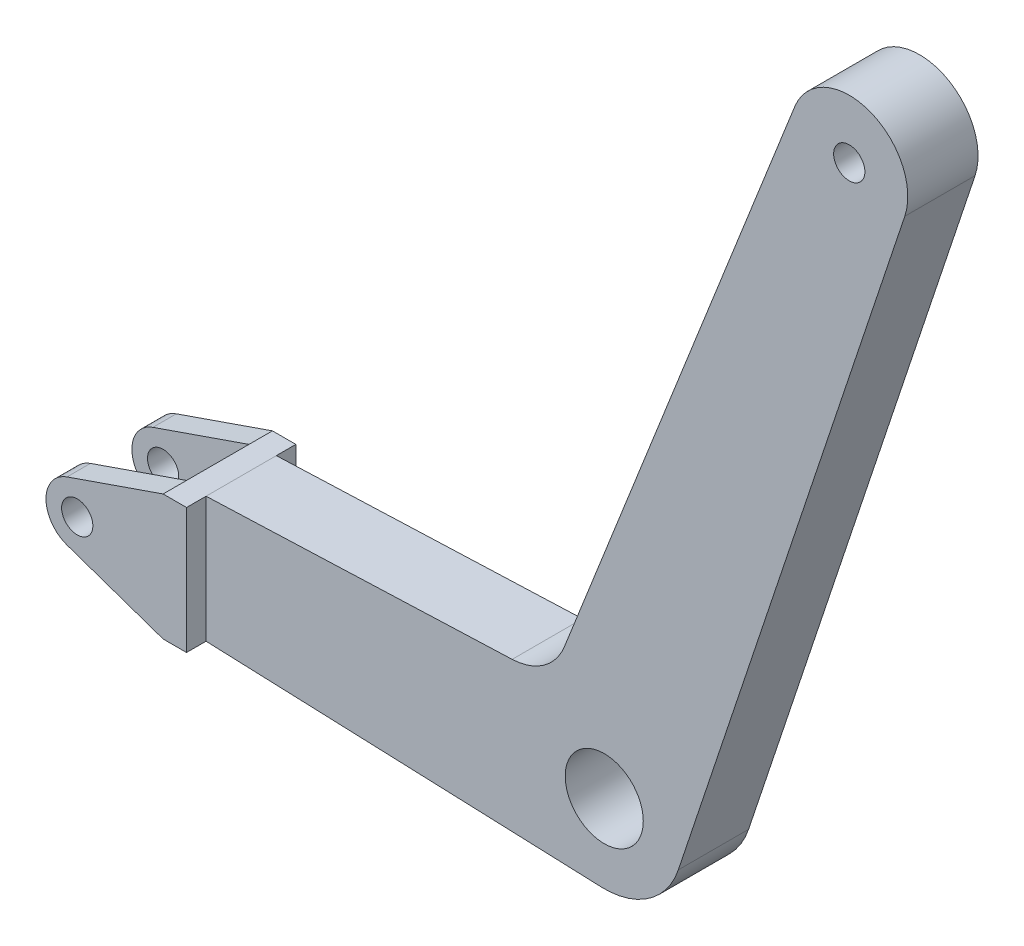
ISO-10303-21;
HEADER;
FILE_DESCRIPTION(('STEP AP214'),'2;1');
FILE_NAME('part.step','',(''),(''),'','','');
FILE_SCHEMA(('AUTOMOTIVE_DESIGN { 1 0 10303 214 1 1 1 1 }'));
ENDSEC;
DATA;
#1=APPLICATION_CONTEXT('core data for automotive mechanical design processes');
#2=APPLICATION_PROTOCOL_DEFINITION('international standard','automotive_design',2000,#1);
#3=PRODUCT_CONTEXT('',#1,'mechanical');
#4=PRODUCT('Part','Part','',(#3));
#5=PRODUCT_RELATED_PRODUCT_CATEGORY('part','',(#4));
#6=PRODUCT_DEFINITION_FORMATION('','',#4);
#7=PRODUCT_DEFINITION_CONTEXT('part definition',#1,'design');
#8=PRODUCT_DEFINITION('design','',#6,#7);
#9=PRODUCT_DEFINITION_SHAPE('','',#8);
#10=(LENGTH_UNIT() NAMED_UNIT(*) SI_UNIT(.MILLI.,.METRE.));
#11=(NAMED_UNIT(*) PLANE_ANGLE_UNIT() SI_UNIT($,.RADIAN.));
#12=(NAMED_UNIT(*) SI_UNIT($,.STERADIAN.) SOLID_ANGLE_UNIT());
#13=UNCERTAINTY_MEASURE_WITH_UNIT(LENGTH_MEASURE(1.E-05),#10,'distance_accuracy_value','');
#14=(GEOMETRIC_REPRESENTATION_CONTEXT(3) GLOBAL_UNCERTAINTY_ASSIGNED_CONTEXT((#13)) GLOBAL_UNIT_ASSIGNED_CONTEXT((#10,
#11,#12)) REPRESENTATION_CONTEXT('',''));
#15=CARTESIAN_POINT('',(0.,0.,0.));
#16=DIRECTION('',(0.,0.,1.));
#17=DIRECTION('',(1.,0.,0.));
#18=AXIS2_PLACEMENT_3D('',#15,#16,#17);
#19=CARTESIAN_POINT('',(-108.,0.,-7.49664954264655E-13));
#20=DIRECTION('',(1.,0.,0.));
#21=DIRECTION('',(0.,0.,-1.));
#22=AXIS2_PLACEMENT_3D('',#19,#20,#21);
#23=PLANE('',#22);
#24=DIRECTION('',(0.,1.,0.));
#25=VECTOR('',#24,1.);
#26=CARTESIAN_POINT('',(-108.,16.0888275014176,17.));
#27=LINE('',#26,#25);
#28=CARTESIAN_POINT('',(-108.,-16.0888275014176,17.));
#29=VERTEX_POINT('',#28);
#30=CARTESIAN_POINT('',(-108.,16.0888275014176,17.));
#31=VERTEX_POINT('',#30);
#32=EDGE_CURVE('E62',#29,#31,#27,.T.);
#33=ORIENTED_EDGE('',*,*,#32,.T.);
#34=DIRECTION('',(0.,0.,-1.));
#35=VECTOR('',#34,1.);
#36=CARTESIAN_POINT('',(-108.,16.0888275014176,8.99999999999996));
#37=LINE('',#36,#35);
#38=CARTESIAN_POINT('',(-108.,16.0888275014176,1.));
#39=VERTEX_POINT('',#38);
#40=EDGE_CURVE('E263',#31,#39,#37,.T.);
#41=ORIENTED_EDGE('',*,*,#40,.T.);
#42=DIRECTION('',(0.,1.,0.));
#43=VECTOR('',#42,1.);
#44=CARTESIAN_POINT('',(-108.,16.0888275014176,1.));
#45=LINE('',#44,#43);
#46=CARTESIAN_POINT('',(-108.,-16.0888275014176,0.999999999999999));
#47=VERTEX_POINT('',#46);
#48=EDGE_CURVE('E223',#47,#39,#45,.T.);
#49=ORIENTED_EDGE('',*,*,#48,.F.);
#50=DIRECTION('',(0.,0.,1.));
#51=VECTOR('',#50,1.);
#52=CARTESIAN_POINT('',(-108.,-16.0888275014176,8.99999999999996));
#53=LINE('',#52,#51);
#54=EDGE_CURVE('E264',#47,#29,#53,.T.);
#55=ORIENTED_EDGE('',*,*,#54,.T.);
#56=EDGE_LOOP('',(#33,#41,#49,#55));
#57=FACE_BOUND('',#56,.T.);
#58=ADVANCED_FACE('F45',(#57),#23,.F.);
#59=CARTESIAN_POINT('',(-23.5835194090592,19.1070792466231,18.));
#60=DIRECTION('',(0.0384615384615387,-0.999260081289737,0.));
#61=DIRECTION('',(0.999260081289737,0.0384615384615387,0.));
#62=AXIS2_PLACEMENT_3D('',#59,#60,#61);
#63=PLANE('',#62);
#64=DIRECTION('',(0.,0.,-1.));
#65=VECTOR('',#64,1.);
#66=CARTESIAN_POINT('',(-102.,16.0888275014176,17.9999999999995));
#67=LINE('',#66,#65);
#68=CARTESIAN_POINT('',(-102.,16.0888275014176,18.));
#69=VERTEX_POINT('',#68);
#70=CARTESIAN_POINT('',(-102.,16.0888275014176,0.));
#71=VERTEX_POINT('',#70);
#72=EDGE_CURVE('E300',#69,#71,#67,.T.);
#73=ORIENTED_EDGE('',*,*,#72,.F.);
#74=DIRECTION('',(-0.999260081289737,-0.0384615384615387,0.));
#75=VECTOR('',#74,1.);
#76=CARTESIAN_POINT('',(-23.5835194090592,19.1070792466231,18.));
#77=LINE('',#76,#75);
#78=CARTESIAN_POINT('',(-23.5835194090592,19.1070792466231,18.));
#79=VERTEX_POINT('',#78);
#80=EDGE_CURVE('E329',#79,#69,#77,.T.);
#81=ORIENTED_EDGE('',*,*,#80,.F.);
#82=DIRECTION('',(0.,0.,-1.));
#83=VECTOR('',#82,1.);
#84=CARTESIAN_POINT('',(-23.5835194090592,19.1070792466231,18.));
#85=LINE('',#84,#83);
#86=CARTESIAN_POINT('',(-23.5835194090592,19.1070792466231,0.));
#87=VERTEX_POINT('',#86);
#88=EDGE_CURVE('E55',#79,#87,#85,.T.);
#89=ORIENTED_EDGE('',*,*,#88,.T.);
#90=DIRECTION('',(-0.999260081289737,-0.0384615384615387,0.));
#91=VECTOR('',#90,1.);
#92=CARTESIAN_POINT('',(-23.5835194090592,19.1070792466231,0.));
#93=LINE('',#92,#91);
#94=EDGE_CURVE('E353',#87,#71,#93,.T.);
#95=ORIENTED_EDGE('',*,*,#94,.T.);
#96=EDGE_LOOP('',(#73,#81,#89,#95));
#97=FACE_BOUND('',#96,.T.);
#98=ADVANCED_FACE('F395',(#97),#63,.F.);
#99=CARTESIAN_POINT('',(-0.769230769230769,-19.9852016257947,18.));
#100=DIRECTION('',(0.0384615384615384,0.999260081289737,0.));
#101=DIRECTION('',(-0.999260081289737,0.0384615384615384,0.));
#102=AXIS2_PLACEMENT_3D('',#99,#100,#101);
#103=PLANE('',#102);
#104=DIRECTION('',(0.,0.,1.));
#105=VECTOR('',#104,1.);
#106=CARTESIAN_POINT('',(-102.,-16.0888275014176,17.9999999999993));
#107=LINE('',#106,#105);
#108=CARTESIAN_POINT('',(-102.,-16.0888275014176,0.));
#109=VERTEX_POINT('',#108);
#110=CARTESIAN_POINT('',(-102.,-16.0888275014176,18.));
#111=VERTEX_POINT('',#110);
#112=EDGE_CURVE('E297',#109,#111,#107,.T.);
#113=ORIENTED_EDGE('',*,*,#112,.F.);
#114=DIRECTION('',(0.999260081289737,-0.0384615384615384,0.));
#115=VECTOR('',#114,1.);
#116=CARTESIAN_POINT('',(-0.769230769230769,-19.9852016257947,0.));
#117=LINE('',#116,#115);
#118=CARTESIAN_POINT('',(-0.769230769230769,-19.9852016257947,0.));
#119=VERTEX_POINT('',#118);
#120=EDGE_CURVE('E357',#109,#119,#117,.T.);
#121=ORIENTED_EDGE('',*,*,#120,.T.);
#122=DIRECTION('',(0.,0.,-1.));
#123=VECTOR('',#122,1.);
#124=CARTESIAN_POINT('',(-0.769230769230769,-19.9852016257947,18.));
#125=LINE('',#124,#123);
#126=CARTESIAN_POINT('',(-0.769230769230769,-19.9852016257947,18.));
#127=VERTEX_POINT('',#126);
#128=EDGE_CURVE('E386',#127,#119,#125,.T.);
#129=ORIENTED_EDGE('',*,*,#128,.F.);
#130=DIRECTION('',(0.999260081289737,-0.0384615384615384,0.));
#131=VECTOR('',#130,1.);
#132=CARTESIAN_POINT('',(-0.769230769230769,-19.9852016257947,18.));
#133=LINE('',#132,#131);
#134=EDGE_CURVE('E334',#111,#127,#133,.T.);
#135=ORIENTED_EDGE('',*,*,#134,.F.);
#136=EDGE_LOOP('',(#113,#121,#129,#135));
#137=FACE_BOUND('',#136,.T.);
#138=ADVANCED_FACE('F417',(#137),#103,.F.);
#139=CARTESIAN_POINT('',(-24.1604424859823,34.0959804659692,18.));
#140=DIRECTION('',(0.,0.,1.));
#141=DIRECTION('',(1.,0.,0.));
#142=AXIS2_PLACEMENT_3D('',#139,#140,#141);
#143=PLANE('',#142);
#144=CARTESIAN_POINT('',(62.7606963002597,172.433595914214,18.));
#145=DIRECTION('',(0.,0.,1.));
#146=DIRECTION('',(1.,0.,0.));
#147=AXIS2_PLACEMENT_3D('',#144,#145,#146);
#148=CIRCLE('',#147,4.00000000000001);
#149=CARTESIAN_POINT('',(66.7606963002597,172.433595914214,18.));
#150=VERTEX_POINT('',#149);
#151=EDGE_CURVE('E309',#150,#150,#148,.T.);
#152=ORIENTED_EDGE('',*,*,#151,.F.);
#153=EDGE_LOOP('',(#152));
#154=FACE_BOUND('',#153,.T.);
#155=CARTESIAN_POINT('',(0.,0.,18.));
#156=DIRECTION('',(0.,0.,1.));
#157=DIRECTION('',(1.,0.,0.));
#158=AXIS2_PLACEMENT_3D('',#155,#156,#157);
#159=CIRCLE('',#158,10.);
#160=CARTESIAN_POINT('',(10.,0.,18.));
#161=VERTEX_POINT('',#160);
#162=EDGE_CURVE('E308',#161,#161,#159,.T.);
#163=ORIENTED_EDGE('',*,*,#162,.F.);
#164=EDGE_LOOP('',(#163));
#165=FACE_BOUND('',#164,.T.);
#166=ORIENTED_EDGE('',*,*,#80,.T.);
#167=DIRECTION('',(0.,-1.,0.));
#168=VECTOR('',#167,1.);
#169=CARTESIAN_POINT('',(-102.,34.0959804659692,18.));
#170=LINE('',#169,#168);
#171=EDGE_CURVE('E304',#69,#111,#170,.T.);
#172=ORIENTED_EDGE('',*,*,#171,.T.);
#173=ORIENTED_EDGE('',*,*,#134,.T.);
#174=CARTESIAN_POINT('',(0.,0.,18.));
#175=DIRECTION('',(0.,0.,1.));
#176=DIRECTION('',(1.,0.,0.));
#177=AXIS2_PLACEMENT_3D('',#174,#175,#176);
#178=CIRCLE('',#177,20.);
#179=CARTESIAN_POINT('',(18.973261360885,-6.3257689913201,18.));
#180=VERTEX_POINT('',#179);
#181=EDGE_CURVE('E337',#127,#180,#178,.T.);
#182=ORIENTED_EDGE('',*,*,#181,.T.);
#183=DIRECTION('',(0.316288449566005,0.948663068044252,0.));
#184=VECTOR('',#183,1.);
#185=CARTESIAN_POINT('',(18.973261360885,-6.3257689913201,18.));
#186=LINE('',#185,#184);
#187=CARTESIAN_POINT('',(76.9906423209234,167.689269170724,18.));
#188=VERTEX_POINT('',#187);
#189=EDGE_CURVE('E340',#180,#188,#186,.T.);
#190=ORIENTED_EDGE('',*,*,#189,.T.);
#191=CARTESIAN_POINT('',(62.7606963002597,172.433595914214,18.));
#192=DIRECTION('',(0.,0.,1.));
#193=DIRECTION('',(1.,0.,0.));
#194=AXIS2_PLACEMENT_3D('',#191,#192,#193);
#195=CIRCLE('',#194,15.);
#196=CARTESIAN_POINT('',(48.8103307782272,177.946063764614,18.));
#197=VERTEX_POINT('',#196);
#198=EDGE_CURVE('E343',#188,#197,#195,.T.);
#199=ORIENTED_EDGE('',*,*,#198,.T.);
#200=DIRECTION('',(-0.367497856693302,-0.930024368135496,0.));
#201=VECTOR('',#200,1.);
#202=CARTESIAN_POINT('',(48.8103307782272,177.946063764614,18.));
#203=LINE('',#202,#201);
#204=CARTESIAN_POINT('',(-10.2100769639498,28.5835126155697,18.));
#205=VERTEX_POINT('',#204);
#206=EDGE_CURVE('E346',#197,#205,#203,.T.);
#207=ORIENTED_EDGE('',*,*,#206,.T.);
#208=CARTESIAN_POINT('',(-24.1604424859823,34.0959804659692,18.));
#209=DIRECTION('',(0.,0.,-1.));
#210=DIRECTION('',(1.,0.,0.));
#211=AXIS2_PLACEMENT_3D('',#208,#209,#210);
#212=CIRCLE('',#211,15.);
#213=EDGE_CURVE('E325',#205,#79,#212,.T.);
#214=ORIENTED_EDGE('',*,*,#213,.T.);
#215=EDGE_LOOP('',(#166,#172,#173,#182,#190,#199,#207,#214));
#216=FACE_BOUND('',#215,.T.);
#217=ADVANCED_FACE('F421',(#154,#165,#216),#143,.T.);
#218=CARTESIAN_POINT('',(-24.1604424859823,34.0959804659692,0.));
#219=DIRECTION('',(0.,0.,1.));
#220=DIRECTION('',(1.,0.,0.));
#221=AXIS2_PLACEMENT_3D('',#218,#219,#220);
#222=PLANE('',#221);
#223=CARTESIAN_POINT('',(0.,0.,0.));
#224=DIRECTION('',(0.,0.,1.));
#225=DIRECTION('',(1.,0.,0.));
#226=AXIS2_PLACEMENT_3D('',#223,#224,#225);
#227=CIRCLE('',#226,10.);
#228=CARTESIAN_POINT('',(10.,0.,0.));
#229=VERTEX_POINT('',#228);
#230=EDGE_CURVE('E318',#229,#229,#227,.T.);
#231=ORIENTED_EDGE('',*,*,#230,.T.);
#232=EDGE_LOOP('',(#231));
#233=FACE_BOUND('',#232,.T.);
#234=CARTESIAN_POINT('',(62.7606963002597,172.433595914214,0.));
#235=DIRECTION('',(0.,0.,1.));
#236=DIRECTION('',(1.,0.,0.));
#237=AXIS2_PLACEMENT_3D('',#234,#235,#236);
#238=CIRCLE('',#237,4.00000000000001);
#239=CARTESIAN_POINT('',(66.7606963002597,172.433595914214,0.));
#240=VERTEX_POINT('',#239);
#241=EDGE_CURVE('E314',#240,#240,#238,.T.);
#242=ORIENTED_EDGE('',*,*,#241,.T.);
#243=EDGE_LOOP('',(#242));
#244=FACE_BOUND('',#243,.T.);
#245=DIRECTION('',(0.,-1.,0.));
#246=VECTOR('',#245,1.);
#247=CARTESIAN_POINT('',(-102.,34.0959804659692,0.));
#248=LINE('',#247,#246);
#249=EDGE_CURVE('E11',#71,#109,#248,.T.);
#250=ORIENTED_EDGE('',*,*,#249,.F.);
#251=ORIENTED_EDGE('',*,*,#94,.F.);
#252=CARTESIAN_POINT('',(-24.1604424859823,34.0959804659692,0.));
#253=DIRECTION('',(0.,0.,-1.));
#254=DIRECTION('',(1.,0.,0.));
#255=AXIS2_PLACEMENT_3D('',#252,#253,#254);
#256=CIRCLE('',#255,15.);
#257=CARTESIAN_POINT('',(-10.2100769639498,28.5835126155697,0.));
#258=VERTEX_POINT('',#257);
#259=EDGE_CURVE('E313',#258,#87,#256,.T.);
#260=ORIENTED_EDGE('',*,*,#259,.F.);
#261=DIRECTION('',(-0.367497856693302,-0.930024368135496,0.));
#262=VECTOR('',#261,1.);
#263=CARTESIAN_POINT('',(48.8103307782272,177.946063764614,0.));
#264=LINE('',#263,#262);
#265=CARTESIAN_POINT('',(48.8103307782272,177.946063764614,0.));
#266=VERTEX_POINT('',#265);
#267=EDGE_CURVE('E330',#266,#258,#264,.T.);
#268=ORIENTED_EDGE('',*,*,#267,.F.);
#269=CARTESIAN_POINT('',(62.7606963002597,172.433595914214,0.));
#270=DIRECTION('',(0.,0.,1.));
#271=DIRECTION('',(1.,0.,0.));
#272=AXIS2_PLACEMENT_3D('',#269,#270,#271);
#273=CIRCLE('',#272,15.);
#274=CARTESIAN_POINT('',(76.9906423209234,167.689269170724,0.));
#275=VERTEX_POINT('',#274);
#276=EDGE_CURVE('E366',#275,#266,#273,.T.);
#277=ORIENTED_EDGE('',*,*,#276,.F.);
#278=DIRECTION('',(0.316288449566005,0.948663068044252,0.));
#279=VECTOR('',#278,1.);
#280=CARTESIAN_POINT('',(18.973261360885,-6.3257689913201,0.));
#281=LINE('',#280,#279);
#282=CARTESIAN_POINT('',(18.973261360885,-6.3257689913201,0.));
#283=VERTEX_POINT('',#282);
#284=EDGE_CURVE('E363',#283,#275,#281,.T.);
#285=ORIENTED_EDGE('',*,*,#284,.F.);
#286=CARTESIAN_POINT('',(0.,0.,0.));
#287=DIRECTION('',(0.,0.,1.));
#288=DIRECTION('',(1.,0.,0.));
#289=AXIS2_PLACEMENT_3D('',#286,#287,#288);
#290=CIRCLE('',#289,20.);
#291=EDGE_CURVE('E360',#119,#283,#290,.T.);
#292=ORIENTED_EDGE('',*,*,#291,.F.);
#293=ORIENTED_EDGE('',*,*,#120,.F.);
#294=EDGE_LOOP('',(#250,#251,#260,#268,#277,#285,#292,#293));
#295=FACE_BOUND('',#294,.T.);
#296=ADVANCED_FACE('F403',(#233,#244,#295),#222,.F.);
#297=CARTESIAN_POINT('',(-24.1604424859823,34.0959804659692,18.));
#298=DIRECTION('',(0.,0.,-1.));
#299=DIRECTION('',(-1.,0.,0.));
#300=AXIS2_PLACEMENT_3D('',#297,#298,#299);
#301=CYLINDRICAL_SURFACE('',#300,15.);
#302=ORIENTED_EDGE('',*,*,#259,.T.);
#303=ORIENTED_EDGE('',*,*,#88,.F.);
#304=ORIENTED_EDGE('',*,*,#213,.F.);
#305=DIRECTION('',(0.,0.,-1.));
#306=VECTOR('',#305,1.);
#307=CARTESIAN_POINT('',(-10.2100769639498,28.5835126155697,18.));
#308=LINE('',#307,#306);
#309=EDGE_CURVE('E349',#205,#258,#308,.T.);
#310=ORIENTED_EDGE('',*,*,#309,.T.);
#311=EDGE_LOOP('',(#302,#303,#304,#310));
#312=FACE_BOUND('',#311,.T.);
#313=ADVANCED_FACE('F47',(#312),#301,.F.);
#314=CARTESIAN_POINT('',(0.,0.,18.));
#315=DIRECTION('',(0.,0.,-1.));
#316=DIRECTION('',(-1.,0.,0.));
#317=AXIS2_PLACEMENT_3D('',#314,#315,#316);
#318=CYLINDRICAL_SURFACE('',#317,20.);
#319=ORIENTED_EDGE('',*,*,#291,.T.);
#320=DIRECTION('',(0.,0.,-1.));
#321=VECTOR('',#320,1.);
#322=CARTESIAN_POINT('',(18.973261360885,-6.3257689913201,18.));
#323=LINE('',#322,#321);
#324=EDGE_CURVE('E382',#180,#283,#323,.T.);
#325=ORIENTED_EDGE('',*,*,#324,.F.);
#326=ORIENTED_EDGE('',*,*,#181,.F.);
#327=ORIENTED_EDGE('',*,*,#128,.T.);
#328=EDGE_LOOP('',(#319,#325,#326,#327));
#329=FACE_BOUND('',#328,.T.);
#330=ADVANCED_FACE('F507',(#329),#318,.T.);
#331=CARTESIAN_POINT('',(18.973261360885,-6.3257689913201,18.));
#332=DIRECTION('',(-0.948663068044252,0.316288449566005,0.));
#333=DIRECTION('',(-0.316288449566005,-0.948663068044252,0.));
#334=AXIS2_PLACEMENT_3D('',#331,#332,#333);
#335=PLANE('',#334);
#336=ORIENTED_EDGE('',*,*,#284,.T.);
#337=DIRECTION('',(0.,0.,-1.));
#338=VECTOR('',#337,1.);
#339=CARTESIAN_POINT('',(76.9906423209234,167.689269170724,18.));
#340=LINE('',#339,#338);
#341=EDGE_CURVE('E378',#188,#275,#340,.T.);
#342=ORIENTED_EDGE('',*,*,#341,.F.);
#343=ORIENTED_EDGE('',*,*,#189,.F.);
#344=ORIENTED_EDGE('',*,*,#324,.T.);
#345=EDGE_LOOP('',(#336,#342,#343,#344));
#346=FACE_BOUND('',#345,.T.);
#347=ADVANCED_FACE('F503',(#346),#335,.F.);
#348=CARTESIAN_POINT('',(62.7606963002597,172.433595914214,18.));
#349=DIRECTION('',(0.,0.,-1.));
#350=DIRECTION('',(-1.,0.,0.));
#351=AXIS2_PLACEMENT_3D('',#348,#349,#350);
#352=CYLINDRICAL_SURFACE('',#351,15.);
#353=ORIENTED_EDGE('',*,*,#276,.T.);
#354=DIRECTION('',(0.,0.,-1.));
#355=VECTOR('',#354,1.);
#356=CARTESIAN_POINT('',(48.8103307782272,177.946063764614,18.));
#357=LINE('',#356,#355);
#358=EDGE_CURVE('E374',#197,#266,#357,.T.);
#359=ORIENTED_EDGE('',*,*,#358,.F.);
#360=ORIENTED_EDGE('',*,*,#198,.F.);
#361=ORIENTED_EDGE('',*,*,#341,.T.);
#362=EDGE_LOOP('',(#353,#359,#360,#361));
#363=FACE_BOUND('',#362,.T.);
#364=ADVANCED_FACE('F499',(#363),#352,.T.);
#365=CARTESIAN_POINT('',(48.8103307782272,177.946063764614,18.));
#366=DIRECTION('',(0.930024368135496,-0.367497856693302,0.));
#367=DIRECTION('',(0.367497856693302,0.930024368135496,0.));
#368=AXIS2_PLACEMENT_3D('',#365,#366,#367);
#369=PLANE('',#368);
#370=ORIENTED_EDGE('',*,*,#267,.T.);
#371=ORIENTED_EDGE('',*,*,#309,.F.);
#372=ORIENTED_EDGE('',*,*,#206,.F.);
#373=ORIENTED_EDGE('',*,*,#358,.T.);
#374=EDGE_LOOP('',(#370,#371,#372,#373));
#375=FACE_BOUND('',#374,.T.);
#376=ADVANCED_FACE('F489',(#375),#369,.F.);
#377=CARTESIAN_POINT('',(0.,0.,18.));
#378=DIRECTION('',(0.,0.,-1.));
#379=DIRECTION('',(-1.,0.,0.));
#380=AXIS2_PLACEMENT_3D('',#377,#378,#379);
#381=CYLINDRICAL_SURFACE('',#380,10.);
#382=ORIENTED_EDGE('',*,*,#162,.T.);
#383=EDGE_LOOP('',(#382));
#384=FACE_BOUND('',#383,.T.);
#385=ORIENTED_EDGE('',*,*,#230,.F.);
#386=EDGE_LOOP('',(#385));
#387=FACE_BOUND('',#386,.T.);
#388=ADVANCED_FACE('F485',(#384,#387),#381,.F.);
#389=CARTESIAN_POINT('',(62.7606963002597,172.433595914214,18.));
#390=DIRECTION('',(0.,0.,-1.));
#391=DIRECTION('',(-1.,0.,0.));
#392=AXIS2_PLACEMENT_3D('',#389,#390,#391);
#393=CYLINDRICAL_SURFACE('',#392,4.00000000000001);
#394=ORIENTED_EDGE('',*,*,#151,.T.);
#395=EDGE_LOOP('',(#394));
#396=FACE_BOUND('',#395,.T.);
#397=ORIENTED_EDGE('',*,*,#241,.F.);
#398=EDGE_LOOP('',(#397));
#399=FACE_BOUND('',#398,.T.);
#400=ADVANCED_FACE('F482',(#396,#399),#393,.F.);
#401=CARTESIAN_POINT('',(-102.,0.,-7.07767178198537E-13));
#402=DIRECTION('',(1.,0.,0.));
#403=DIRECTION('',(0.,0.,-1.));
#404=AXIS2_PLACEMENT_3D('',#401,#402,#403);
#405=PLANE('',#404);
#406=ORIENTED_EDGE('',*,*,#171,.F.);
#407=DIRECTION('',(0.,0.,-1.));
#408=VECTOR('',#407,1.);
#409=CARTESIAN_POINT('',(-102.,16.0888275014176,9.));
#410=LINE('',#409,#408);
#411=CARTESIAN_POINT('',(-102.,16.0888275014176,23.));
#412=VERTEX_POINT('',#411);
#413=EDGE_CURVE('E272',#412,#69,#410,.T.);
#414=ORIENTED_EDGE('',*,*,#413,.F.);
#415=DIRECTION('',(0.,1.,0.));
#416=VECTOR('',#415,1.);
#417=CARTESIAN_POINT('',(-102.,16.0888275014176,23.));
#418=LINE('',#417,#416);
#419=CARTESIAN_POINT('',(-102.,-16.0888275014176,23.));
#420=VERTEX_POINT('',#419);
#421=EDGE_CURVE('E258',#420,#412,#418,.T.);
#422=ORIENTED_EDGE('',*,*,#421,.F.);
#423=DIRECTION('',(0.,0.,1.));
#424=VECTOR('',#423,1.);
#425=CARTESIAN_POINT('',(-102.,-16.0888275014176,9.));
#426=LINE('',#425,#424);
#427=EDGE_CURVE('E279',#111,#420,#426,.T.);
#428=ORIENTED_EDGE('',*,*,#427,.F.);
#429=EDGE_LOOP('',(#406,#414,#422,#428));
#430=FACE_BOUND('',#429,.T.);
#431=ADVANCED_FACE('F424',(#430),#405,.T.);
#432=CARTESIAN_POINT('',(-108.,16.0888275014176,23.));
#433=DIRECTION('',(0.,0.,-1.));
#434=DIRECTION('',(-1.,0.,0.));
#435=AXIS2_PLACEMENT_3D('',#432,#433,#434);
#436=PLANE('',#435);
#437=CARTESIAN_POINT('',(-130.,0.,22.9999999999998));
#438=DIRECTION('',(0.,0.,-1.));
#439=DIRECTION('',(-1.,0.,0.));
#440=AXIS2_PLACEMENT_3D('',#437,#438,#439);
#441=CIRCLE('',#440,3.99999999999999);
#442=CARTESIAN_POINT('',(-134.,0.,22.9999999999998));
#443=VERTEX_POINT('',#442);
#444=EDGE_CURVE('E210',#443,#443,#441,.T.);
#445=ORIENTED_EDGE('',*,*,#444,.T.);
#446=EDGE_LOOP('',(#445));
#447=FACE_BOUND('',#446,.T.);
#448=ORIENTED_EDGE('',*,*,#421,.T.);
#449=DIRECTION('',(1.,0.,0.));
#450=VECTOR('',#449,1.);
#451=CARTESIAN_POINT('',(-108.,16.0888275014176,23.));
#452=LINE('',#451,#450);
#453=CARTESIAN_POINT('',(-108.,16.0888275014176,23.));
#454=VERTEX_POINT('',#453);
#455=EDGE_CURVE('E180',#454,#412,#452,.T.);
#456=ORIENTED_EDGE('',*,*,#455,.F.);
#457=DIRECTION('',(-0.944896080575473,-0.327370427670414,0.));
#458=VECTOR('',#457,1.);
#459=CARTESIAN_POINT('',(-108.,16.0888275014176,23.));
#460=LINE('',#459,#458);
#461=CARTESIAN_POINT('',(-132.619002914747,7.55928263537139,23.));
#462=VERTEX_POINT('',#461);
#463=EDGE_CURVE('E171',#454,#462,#460,.T.);
#464=ORIENTED_EDGE('',*,*,#463,.T.);
#465=CARTESIAN_POINT('',(-129.999999999921,-3.39289127167856E-11,23.));
#466=DIRECTION('',(0.,0.,1.));
#467=DIRECTION('',(1.,0.,0.));
#468=AXIS2_PLACEMENT_3D('',#465,#466,#467);
#469=CIRCLE('',#468,8.00012063845314);
#470=CARTESIAN_POINT('',(-132.619002914728,-7.55928263544569,23.));
#471=VERTEX_POINT('',#470);
#472=EDGE_CURVE('E177',#462,#471,#469,.T.);
#473=ORIENTED_EDGE('',*,*,#472,.T.);
#474=DIRECTION('',(0.944896080576278,-0.327370427668089,0.));
#475=VECTOR('',#474,1.);
#476=CARTESIAN_POINT('',(-108.,-16.0888275014176,23.));
#477=LINE('',#476,#475);
#478=CARTESIAN_POINT('',(-108.,-16.0888275014176,23.));
#479=VERTEX_POINT('',#478);
#480=EDGE_CURVE('E202',#471,#479,#477,.T.);
#481=ORIENTED_EDGE('',*,*,#480,.T.);
#482=DIRECTION('',(1.,0.,0.));
#483=VECTOR('',#482,1.);
#484=CARTESIAN_POINT('',(-108.,-16.0888275014176,23.));
#485=LINE('',#484,#483);
#486=EDGE_CURVE('E293',#479,#420,#485,.T.);
#487=ORIENTED_EDGE('',*,*,#486,.T.);
#488=EDGE_LOOP('',(#448,#456,#464,#473,#481,#487));
#489=FACE_BOUND('',#488,.T.);
#490=ADVANCED_FACE('F174',(#447,#489),#436,.F.);
#491=CARTESIAN_POINT('',(-108.,16.0888275014176,8.99999999999996));
#492=DIRECTION('',(0.,-1.,0.));
#493=DIRECTION('',(0.,0.,-1.));
#494=AXIS2_PLACEMENT_3D('',#491,#492,#493);
#495=PLANE('',#494);
#496=ORIENTED_EDGE('',*,*,#413,.T.);
#497=ORIENTED_EDGE('',*,*,#72,.T.);
#498=CARTESIAN_POINT('',(-102.,16.0888275014176,-5.));
#499=VERTEX_POINT('',#498);
#500=EDGE_CURVE('E271',#71,#499,#410,.T.);
#501=ORIENTED_EDGE('',*,*,#500,.T.);
#502=DIRECTION('',(1.,0.,0.));
#503=VECTOR('',#502,1.);
#504=CARTESIAN_POINT('',(-108.,16.0888275014176,-5.00000000000004));
#505=LINE('',#504,#503);
#506=CARTESIAN_POINT('',(-108.,16.0888275014176,-5.00000000000004));
#507=VERTEX_POINT('',#506);
#508=EDGE_CURVE('E287',#507,#499,#505,.T.);
#509=ORIENTED_EDGE('',*,*,#508,.F.);
#510=DIRECTION('',(0.,0.,-1.));
#511=VECTOR('',#510,1.);
#512=CARTESIAN_POINT('',(-108.,16.0888275014176,1.));
#513=LINE('',#512,#511);
#514=EDGE_CURVE('E254',#39,#507,#513,.T.);
#515=ORIENTED_EDGE('',*,*,#514,.F.);
#516=ORIENTED_EDGE('',*,*,#40,.F.);
#517=EDGE_CURVE('E265',#454,#31,#37,.T.);
#518=ORIENTED_EDGE('',*,*,#517,.F.);
#519=ORIENTED_EDGE('',*,*,#455,.T.);
#520=EDGE_LOOP('',(#496,#497,#501,#509,#515,#516,#518,#519));
#521=FACE_BOUND('',#520,.T.);
#522=ADVANCED_FACE('F427',(#521),#495,.F.);
#523=CARTESIAN_POINT('',(-108.,16.0888275014176,-5.00000000000004));
#524=DIRECTION('',(0.,0.,1.));
#525=DIRECTION('',(1.,0.,0.));
#526=AXIS2_PLACEMENT_3D('',#523,#524,#525);
#527=PLANE('',#526);
#528=CARTESIAN_POINT('',(-130.,0.,-5.0000000000002));
#529=DIRECTION('',(0.,0.,1.));
#530=DIRECTION('',(1.,0.,0.));
#531=AXIS2_PLACEMENT_3D('',#528,#529,#530);
#532=CIRCLE('',#531,3.99999999999999);
#533=CARTESIAN_POINT('',(-126.,0.,-5.00000000000017));
#534=VERTEX_POINT('',#533);
#535=EDGE_CURVE('E641',#534,#534,#532,.T.);
#536=ORIENTED_EDGE('',*,*,#535,.T.);
#537=EDGE_LOOP('',(#536));
#538=FACE_BOUND('',#537,.T.);
#539=DIRECTION('',(0.,-1.,0.));
#540=VECTOR('',#539,1.);
#541=CARTESIAN_POINT('',(-102.,16.0888275014176,-5.));
#542=LINE('',#541,#540);
#543=CARTESIAN_POINT('',(-102.,-16.0888275014176,-5.));
#544=VERTEX_POINT('',#543);
#545=EDGE_CURVE('E276',#499,#544,#542,.T.);
#546=ORIENTED_EDGE('',*,*,#545,.T.);
#547=DIRECTION('',(1.,0.,0.));
#548=VECTOR('',#547,1.);
#549=CARTESIAN_POINT('',(-108.,-16.0888275014176,-5.00000000000004));
#550=LINE('',#549,#548);
#551=CARTESIAN_POINT('',(-108.,-16.0888275014176,-5.00000000000004));
#552=VERTEX_POINT('',#551);
#553=EDGE_CURVE('E268',#552,#544,#550,.T.);
#554=ORIENTED_EDGE('',*,*,#553,.F.);
#555=DIRECTION('',(0.944896080576278,-0.327370427668089,0.));
#556=VECTOR('',#555,1.);
#557=CARTESIAN_POINT('',(-108.,-16.0888275014176,-5.));
#558=LINE('',#557,#556);
#559=CARTESIAN_POINT('',(-132.619002914728,-7.55928263544569,-5.));
#560=VERTEX_POINT('',#559);
#561=EDGE_CURVE('E228',#560,#552,#558,.T.);
#562=ORIENTED_EDGE('',*,*,#561,.F.);
#563=CARTESIAN_POINT('',(-129.999999999921,-3.39289127167856E-11,-5.));
#564=DIRECTION('',(0.,0.,1.));
#565=DIRECTION('',(1.,0.,0.));
#566=AXIS2_PLACEMENT_3D('',#563,#564,#565);
#567=CIRCLE('',#566,8.00012063845314);
#568=CARTESIAN_POINT('',(-132.619002914747,7.55928263537139,-5.));
#569=VERTEX_POINT('',#568);
#570=EDGE_CURVE('E241',#569,#560,#567,.T.);
#571=ORIENTED_EDGE('',*,*,#570,.F.);
#572=DIRECTION('',(-0.944896080575473,-0.327370427670414,0.));
#573=VECTOR('',#572,1.);
#574=CARTESIAN_POINT('',(-108.,16.0888275014176,-5.));
#575=LINE('',#574,#573);
#576=EDGE_CURVE('E195',#507,#569,#575,.T.);
#577=ORIENTED_EDGE('',*,*,#576,.F.);
#578=ORIENTED_EDGE('',*,*,#508,.T.);
#579=EDGE_LOOP('',(#546,#554,#562,#571,#577,#578));
#580=FACE_BOUND('',#579,.T.);
#581=ADVANCED_FACE('F441',(#538,#580),#527,.F.);
#582=CARTESIAN_POINT('',(-108.,-16.0888275014176,8.99999999999996));
#583=DIRECTION('',(0.,1.,0.));
#584=DIRECTION('',(0.,0.,1.));
#585=AXIS2_PLACEMENT_3D('',#582,#583,#584);
#586=PLANE('',#585);
#587=EDGE_CURVE('E280',#544,#109,#426,.T.);
#588=ORIENTED_EDGE('',*,*,#587,.T.);
#589=ORIENTED_EDGE('',*,*,#112,.T.);
#590=ORIENTED_EDGE('',*,*,#427,.T.);
#591=ORIENTED_EDGE('',*,*,#486,.F.);
#592=DIRECTION('',(0.,0.,-1.));
#593=VECTOR('',#592,1.);
#594=CARTESIAN_POINT('',(-108.,-16.0888275014176,23.));
#595=LINE('',#594,#593);
#596=EDGE_CURVE('E70',#479,#29,#595,.T.);
#597=ORIENTED_EDGE('',*,*,#596,.T.);
#598=ORIENTED_EDGE('',*,*,#54,.F.);
#599=EDGE_CURVE('E259',#552,#47,#53,.T.);
#600=ORIENTED_EDGE('',*,*,#599,.F.);
#601=ORIENTED_EDGE('',*,*,#553,.T.);
#602=EDGE_LOOP('',(#588,#589,#590,#591,#597,#598,#600,#601));
#603=FACE_BOUND('',#602,.T.);
#604=ADVANCED_FACE('F412',(#603),#586,.F.);
#605=ORIENTED_EDGE('',*,*,#500,.F.);
#606=ORIENTED_EDGE('',*,*,#249,.T.);
#607=ORIENTED_EDGE('',*,*,#587,.F.);
#608=ORIENTED_EDGE('',*,*,#545,.F.);
#609=EDGE_LOOP('',(#605,#606,#607,#608));
#610=FACE_BOUND('',#609,.T.);
#611=ADVANCED_FACE('F409',(#610),#405,.T.);
#612=CARTESIAN_POINT('',(-108.,16.0888275014176,1.));
#613=DIRECTION('',(0.327370427670414,-0.944896080575473,0.));
#614=DIRECTION('',(0.944896080575473,0.327370427670414,0.));
#615=AXIS2_PLACEMENT_3D('',#612,#613,#614);
#616=PLANE('',#615);
#617=ORIENTED_EDGE('',*,*,#576,.T.);
#618=DIRECTION('',(0.,0.,-1.));
#619=VECTOR('',#618,1.);
#620=CARTESIAN_POINT('',(-132.619002914747,7.55928263537139,1.));
#621=LINE('',#620,#619);
#622=CARTESIAN_POINT('',(-132.619002914747,7.55928263537139,1.));
#623=VERTEX_POINT('',#622);
#624=EDGE_CURVE('E250',#623,#569,#621,.T.);
#625=ORIENTED_EDGE('',*,*,#624,.F.);
#626=DIRECTION('',(-0.944896080575473,-0.327370427670414,0.));
#627=VECTOR('',#626,1.);
#628=CARTESIAN_POINT('',(-108.,16.0888275014176,1.));
#629=LINE('',#628,#627);
#630=EDGE_CURVE('E227',#39,#623,#629,.T.);
#631=ORIENTED_EDGE('',*,*,#630,.F.);
#632=ORIENTED_EDGE('',*,*,#514,.T.);
#633=EDGE_LOOP('',(#617,#625,#631,#632));
#634=FACE_BOUND('',#633,.T.);
#635=ADVANCED_FACE('F446',(#634),#616,.F.);
#636=CARTESIAN_POINT('',(-129.999999999921,-3.39289127167856E-11,1.));
#637=DIRECTION('',(0.,0.,-1.));
#638=DIRECTION('',(-1.,0.,0.));
#639=AXIS2_PLACEMENT_3D('',#636,#637,#638);
#640=CYLINDRICAL_SURFACE('',#639,8.00012063845314);
#641=ORIENTED_EDGE('',*,*,#570,.T.);
#642=DIRECTION('',(0.,0.,-1.));
#643=VECTOR('',#642,1.);
#644=CARTESIAN_POINT('',(-132.619002914728,-7.55928263544569,1.));
#645=LINE('',#644,#643);
#646=CARTESIAN_POINT('',(-132.619002914728,-7.55928263544569,1.));
#647=VERTEX_POINT('',#646);
#648=EDGE_CURVE('E238',#647,#560,#645,.T.);
#649=ORIENTED_EDGE('',*,*,#648,.F.);
#650=CARTESIAN_POINT('',(-129.999999999921,-3.39289127167856E-11,1.));
#651=DIRECTION('',(0.,0.,1.));
#652=DIRECTION('',(1.,0.,0.));
#653=AXIS2_PLACEMENT_3D('',#650,#651,#652);
#654=CIRCLE('',#653,8.00012063845314);
#655=EDGE_CURVE('E231',#623,#647,#654,.T.);
#656=ORIENTED_EDGE('',*,*,#655,.F.);
#657=ORIENTED_EDGE('',*,*,#624,.T.);
#658=EDGE_LOOP('',(#641,#649,#656,#657));
#659=FACE_BOUND('',#658,.T.);
#660=ADVANCED_FACE('F455',(#659),#640,.T.);
#661=CARTESIAN_POINT('',(-108.,-16.0888275014176,1.));
#662=DIRECTION('',(0.327370427668089,0.944896080576278,0.));
#663=DIRECTION('',(-0.944896080576278,0.327370427668089,0.));
#664=AXIS2_PLACEMENT_3D('',#661,#662,#663);
#665=PLANE('',#664);
#666=ORIENTED_EDGE('',*,*,#561,.T.);
#667=ORIENTED_EDGE('',*,*,#599,.T.);
#668=DIRECTION('',(0.944896080576278,-0.327370427668089,0.));
#669=VECTOR('',#668,1.);
#670=CARTESIAN_POINT('',(-108.,-16.0888275014176,1.));
#671=LINE('',#670,#669);
#672=EDGE_CURVE('E234',#647,#47,#671,.T.);
#673=ORIENTED_EDGE('',*,*,#672,.F.);
#674=ORIENTED_EDGE('',*,*,#648,.T.);
#675=EDGE_LOOP('',(#666,#667,#673,#674));
#676=FACE_BOUND('',#675,.T.);
#677=ADVANCED_FACE('F452',(#676),#665,.F.);
#678=CARTESIAN_POINT('',(-129.999999999921,-3.39289127167856E-11,1.));
#679=DIRECTION('',(0.,0.,1.));
#680=DIRECTION('',(1.,0.,0.));
#681=AXIS2_PLACEMENT_3D('',#678,#679,#680);
#682=PLANE('',#681);
#683=CARTESIAN_POINT('',(-130.,0.,1.));
#684=DIRECTION('',(0.,0.,1.));
#685=DIRECTION('',(1.,0.,0.));
#686=AXIS2_PLACEMENT_3D('',#683,#684,#685);
#687=CIRCLE('',#686,3.99999999999999);
#688=CARTESIAN_POINT('',(-126.,0.,1.));
#689=VERTEX_POINT('',#688);
#690=EDGE_CURVE('E638',#689,#689,#687,.T.);
#691=ORIENTED_EDGE('',*,*,#690,.F.);
#692=EDGE_LOOP('',(#691));
#693=FACE_BOUND('',#692,.T.);
#694=ORIENTED_EDGE('',*,*,#48,.T.);
#695=ORIENTED_EDGE('',*,*,#630,.T.);
#696=ORIENTED_EDGE('',*,*,#655,.T.);
#697=ORIENTED_EDGE('',*,*,#672,.T.);
#698=EDGE_LOOP('',(#694,#695,#696,#697));
#699=FACE_BOUND('',#698,.T.);
#700=ADVANCED_FACE('F449',(#693,#699),#682,.T.);
#701=CARTESIAN_POINT('',(-108.,16.0888275014176,23.));
#702=DIRECTION('',(0.327370427670414,-0.944896080575473,0.));
#703=DIRECTION('',(0.944896080575473,0.327370427670414,0.));
#704=AXIS2_PLACEMENT_3D('',#701,#702,#703);
#705=PLANE('',#704);
#706=DIRECTION('',(-0.944896080575473,-0.327370427670414,0.));
#707=VECTOR('',#706,1.);
#708=CARTESIAN_POINT('',(-108.,16.0888275014176,17.));
#709=LINE('',#708,#707);
#710=CARTESIAN_POINT('',(-132.619002914747,7.55928263537139,17.));
#711=VERTEX_POINT('',#710);
#712=EDGE_CURVE('E191',#31,#711,#709,.T.);
#713=ORIENTED_EDGE('',*,*,#712,.T.);
#714=DIRECTION('',(0.,0.,-1.));
#715=VECTOR('',#714,1.);
#716=CARTESIAN_POINT('',(-132.619002914747,7.55928263537139,23.));
#717=LINE('',#716,#715);
#718=EDGE_CURVE('E188',#462,#711,#717,.T.);
#719=ORIENTED_EDGE('',*,*,#718,.F.);
#720=ORIENTED_EDGE('',*,*,#463,.F.);
#721=ORIENTED_EDGE('',*,*,#517,.T.);
#722=EDGE_LOOP('',(#713,#719,#720,#721));
#723=FACE_BOUND('',#722,.T.);
#724=ADVANCED_FACE('F189',(#723),#705,.F.);
#725=CARTESIAN_POINT('',(-129.999999999921,-3.39289127167856E-11,23.));
#726=DIRECTION('',(0.,0.,-1.));
#727=DIRECTION('',(-1.,0.,0.));
#728=AXIS2_PLACEMENT_3D('',#725,#726,#727);
#729=CYLINDRICAL_SURFACE('',#728,8.00012063845314);
#730=CARTESIAN_POINT('',(-129.999999999921,-3.39289127167856E-11,17.));
#731=DIRECTION('',(0.,0.,1.));
#732=DIRECTION('',(1.,0.,0.));
#733=AXIS2_PLACEMENT_3D('',#730,#731,#732);
#734=CIRCLE('',#733,8.00012063845314);
#735=CARTESIAN_POINT('',(-132.619002914728,-7.55928263544569,17.));
#736=VERTEX_POINT('',#735);
#737=EDGE_CURVE('E213',#711,#736,#734,.T.);
#738=ORIENTED_EDGE('',*,*,#737,.T.);
#739=DIRECTION('',(0.,0.,-1.));
#740=VECTOR('',#739,1.);
#741=CARTESIAN_POINT('',(-132.619002914728,-7.55928263544569,23.));
#742=LINE('',#741,#740);
#743=EDGE_CURVE('E196',#471,#736,#742,.T.);
#744=ORIENTED_EDGE('',*,*,#743,.F.);
#745=ORIENTED_EDGE('',*,*,#472,.F.);
#746=ORIENTED_EDGE('',*,*,#718,.T.);
#747=EDGE_LOOP('',(#738,#744,#745,#746));
#748=FACE_BOUND('',#747,.T.);
#749=ADVANCED_FACE('F198',(#748),#729,.T.);
#750=CARTESIAN_POINT('',(-108.,-16.0888275014176,23.));
#751=DIRECTION('',(0.327370427668089,0.944896080576278,0.));
#752=DIRECTION('',(-0.944896080576278,0.327370427668089,0.));
#753=AXIS2_PLACEMENT_3D('',#750,#751,#752);
#754=PLANE('',#753);
#755=DIRECTION('',(0.944896080576278,-0.327370427668089,0.));
#756=VECTOR('',#755,1.);
#757=CARTESIAN_POINT('',(-108.,-16.0888275014176,17.));
#758=LINE('',#757,#756);
#759=EDGE_CURVE('E185',#736,#29,#758,.T.);
#760=ORIENTED_EDGE('',*,*,#759,.T.);
#761=ORIENTED_EDGE('',*,*,#596,.F.);
#762=ORIENTED_EDGE('',*,*,#480,.F.);
#763=ORIENTED_EDGE('',*,*,#743,.T.);
#764=EDGE_LOOP('',(#760,#761,#762,#763));
#765=FACE_BOUND('',#764,.T.);
#766=ADVANCED_FACE('F435',(#765),#754,.F.);
#767=CARTESIAN_POINT('',(-129.999999999921,-3.39289127167856E-11,17.));
#768=DIRECTION('',(0.,0.,1.));
#769=DIRECTION('',(1.,0.,0.));
#770=AXIS2_PLACEMENT_3D('',#767,#768,#769);
#771=PLANE('',#770);
#772=CARTESIAN_POINT('',(-130.,0.,17.));
#773=DIRECTION('',(0.,0.,1.));
#774=DIRECTION('',(1.,0.,0.));
#775=AXIS2_PLACEMENT_3D('',#772,#773,#774);
#776=CIRCLE('',#775,3.99999999999999);
#777=CARTESIAN_POINT('',(-126.,0.,17.));
#778=VERTEX_POINT('',#777);
#779=EDGE_CURVE('E49',#778,#778,#776,.T.);
#780=ORIENTED_EDGE('',*,*,#779,.T.);
#781=EDGE_LOOP('',(#780));
#782=FACE_BOUND('',#781,.T.);
#783=ORIENTED_EDGE('',*,*,#32,.F.);
#784=ORIENTED_EDGE('',*,*,#759,.F.);
#785=ORIENTED_EDGE('',*,*,#737,.F.);
#786=ORIENTED_EDGE('',*,*,#712,.F.);
#787=EDGE_LOOP('',(#783,#784,#785,#786));
#788=FACE_BOUND('',#787,.T.);
#789=ADVANCED_FACE('F432',(#782,#788),#771,.F.);
#790=CARTESIAN_POINT('',(-130.,0.,-30.));
#791=DIRECTION('',(0.,0.,1.));
#792=DIRECTION('',(1.,0.,0.));
#793=AXIS2_PLACEMENT_3D('',#790,#791,#792);
#794=CYLINDRICAL_SURFACE('',#793,3.99999999999999);
#795=ORIENTED_EDGE('',*,*,#779,.F.);
#796=EDGE_LOOP('',(#795));
#797=FACE_BOUND('',#796,.T.);
#798=ORIENTED_EDGE('',*,*,#444,.F.);
#799=EDGE_LOOP('',(#798));
#800=FACE_BOUND('',#799,.T.);
#801=ADVANCED_FACE('F613',(#797,#800),#794,.F.);
#802=ORIENTED_EDGE('',*,*,#690,.T.);
#803=EDGE_LOOP('',(#802));
#804=FACE_BOUND('',#803,.T.);
#805=ORIENTED_EDGE('',*,*,#535,.F.);
#806=EDGE_LOOP('',(#805));
#807=FACE_BOUND('',#806,.T.);
#808=ADVANCED_FACE('F623',(#804,#807),#794,.F.);
#809=CLOSED_SHELL('',(#58,#98,#138,#217,#296,#313,#330,#347,#364,#376,#388,#400,#431,#490,#522,
#581,#604,#611,#635,#660,#677,#700,#724,#749,#766,#789,#801,#808));
#810=MANIFOLD_SOLID_BREP('B2',#809);
#811=ADVANCED_BREP_SHAPE_REPRESENTATION('',(#18,#810),#14);
#812=SHAPE_DEFINITION_REPRESENTATION(#9,#811);
ENDSEC;
END-ISO-10303-21;
